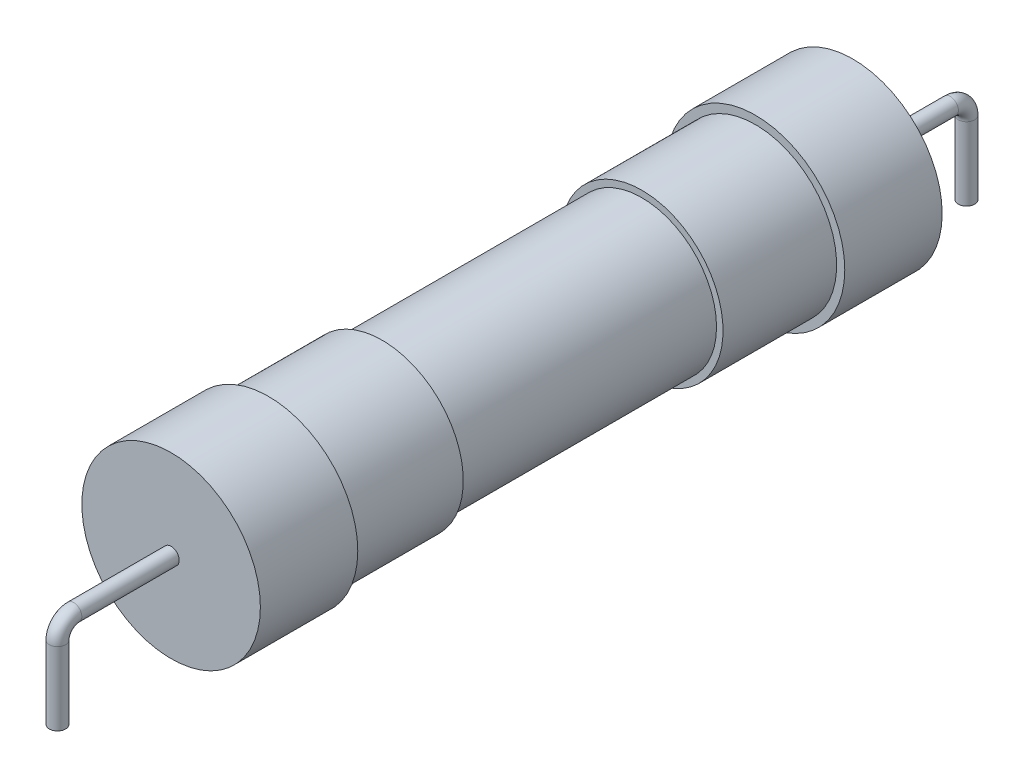
ISO-10303-21;
HEADER;
FILE_DESCRIPTION(('STEP AP214'),'2;1');
FILE_NAME('part.step','',(''),(''),'','','');
FILE_SCHEMA(('AUTOMOTIVE_DESIGN { 1 0 10303 214 1 1 1 1 }'));
ENDSEC;
DATA;
#1=APPLICATION_CONTEXT('core data for automotive mechanical design processes');
#2=APPLICATION_PROTOCOL_DEFINITION('international standard','automotive_design',2000,#1);
#3=PRODUCT_CONTEXT('',#1,'mechanical');
#4=PRODUCT('Part','Part','',(#3));
#5=PRODUCT_RELATED_PRODUCT_CATEGORY('part','',(#4));
#6=PRODUCT_DEFINITION_FORMATION('','',#4);
#7=PRODUCT_DEFINITION_CONTEXT('part definition',#1,'design');
#8=PRODUCT_DEFINITION('design','',#6,#7);
#9=PRODUCT_DEFINITION_SHAPE('','',#8);
#10=(LENGTH_UNIT() NAMED_UNIT(*) SI_UNIT(.MILLI.,.METRE.));
#11=(NAMED_UNIT(*) PLANE_ANGLE_UNIT() SI_UNIT($,.RADIAN.));
#12=(NAMED_UNIT(*) SI_UNIT($,.STERADIAN.) SOLID_ANGLE_UNIT());
#13=UNCERTAINTY_MEASURE_WITH_UNIT(LENGTH_MEASURE(1.E-05),#10,'distance_accuracy_value','');
#14=(GEOMETRIC_REPRESENTATION_CONTEXT(3) GLOBAL_UNCERTAINTY_ASSIGNED_CONTEXT((#13)) GLOBAL_UNIT_ASSIGNED_CONTEXT((#10,
#11,#12)) REPRESENTATION_CONTEXT('',''));
#15=CARTESIAN_POINT('',(0.,0.,0.));
#16=DIRECTION('',(0.,0.,1.));
#17=DIRECTION('',(1.,0.,0.));
#18=AXIS2_PLACEMENT_3D('',#15,#16,#17);
#19=CARTESIAN_POINT('',(0.,-2.75,14.));
#20=DIRECTION('',(0.,-1.,0.));
#21=DIRECTION('',(0.,0.,-1.));
#22=AXIS2_PLACEMENT_3D('',#19,#20,#21);
#23=PLANE('',#22);
#24=CARTESIAN_POINT('',(0.,-2.75,14.));
#25=DIRECTION('',(0.,-1.,0.));
#26=DIRECTION('',(0.,0.,-1.));
#27=AXIS2_PLACEMENT_3D('',#24,#25,#26);
#28=CIRCLE('',#27,0.25);
#29=CARTESIAN_POINT('',(0.,-2.75,13.75));
#30=VERTEX_POINT('',#29);
#31=EDGE_CURVE('E18',#30,#30,#28,.F.);
#32=ORIENTED_EDGE('',*,*,#31,.F.);
#33=EDGE_LOOP('',(#32));
#34=FACE_BOUND('',#33,.T.);
#35=ADVANCED_FACE('F15',(#34),#23,.T.);
#36=CARTESIAN_POINT('',(0.,-2.75,-14.));
#37=DIRECTION('',(0.,1.,0.));
#38=DIRECTION('',(0.,0.,1.));
#39=AXIS2_PLACEMENT_3D('',#36,#37,#38);
#40=PLANE('',#39);
#41=CARTESIAN_POINT('',(0.,-2.75,-14.));
#42=DIRECTION('',(0.,1.,0.));
#43=DIRECTION('',(0.,0.,1.));
#44=AXIS2_PLACEMENT_3D('',#41,#42,#43);
#45=CIRCLE('',#44,0.25);
#46=CARTESIAN_POINT('',(0.,-2.75,-13.75));
#47=VERTEX_POINT('',#46);
#48=EDGE_CURVE('E62',#47,#47,#45,.T.);
#49=ORIENTED_EDGE('',*,*,#48,.F.);
#50=EDGE_LOOP('',(#49));
#51=FACE_BOUND('',#50,.T.);
#52=ADVANCED_FACE('F75',(#51),#40,.F.);
#53=CARTESIAN_POINT('',(0.,-0.5,14.));
#54=DIRECTION('',(0.,-1.,0.));
#55=DIRECTION('',(0.,0.,-1.));
#56=AXIS2_PLACEMENT_3D('',#53,#54,#55);
#57=CYLINDRICAL_SURFACE('',#56,0.25);
#58=ORIENTED_EDGE('',*,*,#31,.T.);
#59=EDGE_LOOP('',(#58));
#60=FACE_BOUND('',#59,.T.);
#61=CARTESIAN_POINT('',(0.,-0.5,14.));
#62=DIRECTION('',(0.,-1.,0.));
#63=DIRECTION('',(0.,0.,1.));
#64=AXIS2_PLACEMENT_3D('',#61,#62,#63);
#65=CIRCLE('',#64,0.25);
#66=CARTESIAN_POINT('',(0.,-0.5,14.25));
#67=VERTEX_POINT('',#66);
#68=EDGE_CURVE('E30',#67,#67,#65,.F.);
#69=ORIENTED_EDGE('',*,*,#68,.F.);
#70=EDGE_LOOP('',(#69));
#71=FACE_BOUND('',#70,.T.);
#72=ADVANCED_FACE('F71',(#60,#71),#57,.T.);
#73=CARTESIAN_POINT('',(0.,-0.5,-14.));
#74=DIRECTION('',(0.,1.,0.));
#75=DIRECTION('',(0.,0.,1.));
#76=AXIS2_PLACEMENT_3D('',#73,#74,#75);
#77=CYLINDRICAL_SURFACE('',#76,0.25);
#78=ORIENTED_EDGE('',*,*,#48,.T.);
#79=EDGE_LOOP('',(#78));
#80=FACE_BOUND('',#79,.T.);
#81=CARTESIAN_POINT('',(0.,-0.5,-14.));
#82=DIRECTION('',(0.,-1.,0.));
#83=DIRECTION('',(0.,0.,-1.));
#84=AXIS2_PLACEMENT_3D('',#81,#82,#83);
#85=CIRCLE('',#84,0.25);
#86=CARTESIAN_POINT('',(0.,-0.5,-14.25));
#87=VERTEX_POINT('',#86);
#88=EDGE_CURVE('E67',#87,#87,#85,.F.);
#89=ORIENTED_EDGE('',*,*,#88,.F.);
#90=EDGE_LOOP('',(#89));
#91=FACE_BOUND('',#90,.T.);
#92=ADVANCED_FACE('F154',(#80,#91),#77,.T.);
#93=CARTESIAN_POINT('',(0.,-0.5,13.5));
#94=DIRECTION('',(1.,0.,0.));
#95=DIRECTION('',(0.,-1.,0.));
#96=AXIS2_PLACEMENT_3D('',#93,#94,#95);
#97=TOROIDAL_SURFACE('',#96,0.5,0.25);
#98=ORIENTED_EDGE('',*,*,#68,.T.);
#99=EDGE_LOOP('',(#98));
#100=FACE_BOUND('',#99,.T.);
#101=CARTESIAN_POINT('',(0.,0.,13.5));
#102=DIRECTION('',(0.,0.,1.));
#103=DIRECTION('',(1.,0.,0.));
#104=AXIS2_PLACEMENT_3D('',#101,#102,#103);
#105=CIRCLE('',#104,0.25);
#106=CARTESIAN_POINT('',(0.25,0.,13.5));
#107=VERTEX_POINT('',#106);
#108=EDGE_CURVE('E147',#107,#107,#105,.F.);
#109=ORIENTED_EDGE('',*,*,#108,.F.);
#110=EDGE_LOOP('',(#109));
#111=FACE_BOUND('',#110,.T.);
#112=ADVANCED_FACE('F140',(#100,#111),#97,.T.);
#113=CARTESIAN_POINT('',(0.,-0.5,-13.5));
#114=DIRECTION('',(-1.,0.,0.));
#115=DIRECTION('',(0.,-1.,0.));
#116=AXIS2_PLACEMENT_3D('',#113,#114,#115);
#117=TOROIDAL_SURFACE('',#116,0.5,0.25);
#118=ORIENTED_EDGE('',*,*,#88,.T.);
#119=EDGE_LOOP('',(#118));
#120=FACE_BOUND('',#119,.T.);
#121=CARTESIAN_POINT('',(0.,0.,-13.5));
#122=DIRECTION('',(0.,0.,1.));
#123=DIRECTION('',(1.,0.,0.));
#124=AXIS2_PLACEMENT_3D('',#121,#122,#123);
#125=CIRCLE('',#124,0.25);
#126=CARTESIAN_POINT('',(0.25,0.,-13.5));
#127=VERTEX_POINT('',#126);
#128=EDGE_CURVE('E61',#127,#127,#125,.T.);
#129=ORIENTED_EDGE('',*,*,#128,.F.);
#130=EDGE_LOOP('',(#129));
#131=FACE_BOUND('',#130,.T.);
#132=ADVANCED_FACE('F135',(#120,#131),#117,.T.);
#133=CARTESIAN_POINT('',(0.,0.,10.5));
#134=DIRECTION('',(0.,0.,1.));
#135=DIRECTION('',(1.,0.,0.));
#136=AXIS2_PLACEMENT_3D('',#133,#134,#135);
#137=CYLINDRICAL_SURFACE('',#136,0.25);
#138=ORIENTED_EDGE('',*,*,#108,.T.);
#139=EDGE_LOOP('',(#138));
#140=FACE_BOUND('',#139,.T.);
#141=CARTESIAN_POINT('',(0.,0.,10.5));
#142=DIRECTION('',(0.,0.,1.));
#143=DIRECTION('',(1.,0.,0.));
#144=AXIS2_PLACEMENT_3D('',#141,#142,#143);
#145=CIRCLE('',#144,0.25);
#146=CARTESIAN_POINT('',(0.25,0.,10.5));
#147=VERTEX_POINT('',#146);
#148=EDGE_CURVE('E59',#147,#147,#145,.F.);
#149=ORIENTED_EDGE('',*,*,#148,.F.);
#150=EDGE_LOOP('',(#149));
#151=FACE_BOUND('',#150,.T.);
#152=ADVANCED_FACE('F131',(#140,#151),#137,.T.);
#153=CARTESIAN_POINT('',(0.,0.,-10.5));
#154=DIRECTION('',(0.,0.,1.));
#155=DIRECTION('',(1.,0.,0.));
#156=AXIS2_PLACEMENT_3D('',#153,#154,#155);
#157=CYLINDRICAL_SURFACE('',#156,0.25);
#158=ORIENTED_EDGE('',*,*,#128,.T.);
#159=EDGE_LOOP('',(#158));
#160=FACE_BOUND('',#159,.T.);
#161=CARTESIAN_POINT('',(0.,0.,-10.5));
#162=DIRECTION('',(0.,0.,1.));
#163=DIRECTION('',(1.,0.,0.));
#164=AXIS2_PLACEMENT_3D('',#161,#162,#163);
#165=CIRCLE('',#164,0.25);
#166=CARTESIAN_POINT('',(0.25,0.,-10.5));
#167=VERTEX_POINT('',#166);
#168=EDGE_CURVE('E56',#167,#167,#165,.F.);
#169=ORIENTED_EDGE('',*,*,#168,.T.);
#170=EDGE_LOOP('',(#169));
#171=FACE_BOUND('',#170,.T.);
#172=ADVANCED_FACE('F127',(#160,#171),#157,.T.);
#173=CARTESIAN_POINT('',(0.,0.,10.5));
#174=DIRECTION('',(0.,0.,1.));
#175=DIRECTION('',(1.,0.,0.));
#176=AXIS2_PLACEMENT_3D('',#173,#174,#175);
#177=PLANE('',#176);
#178=ORIENTED_EDGE('',*,*,#148,.T.);
#179=EDGE_LOOP('',(#178));
#180=FACE_BOUND('',#179,.T.);
#181=CARTESIAN_POINT('',(0.,0.,10.5));
#182=DIRECTION('',(0.,0.,1.));
#183=DIRECTION('',(1.,0.,0.));
#184=AXIS2_PLACEMENT_3D('',#181,#182,#183);
#185=CIRCLE('',#184,2.75);
#186=CARTESIAN_POINT('',(2.75,0.,10.5));
#187=VERTEX_POINT('',#186);
#188=EDGE_CURVE('E53',#187,#187,#185,.F.);
#189=ORIENTED_EDGE('',*,*,#188,.F.);
#190=EDGE_LOOP('',(#189));
#191=FACE_BOUND('',#190,.T.);
#192=ADVANCED_FACE('F123',(#180,#191),#177,.T.);
#193=CARTESIAN_POINT('',(0.,0.,-10.5));
#194=DIRECTION('',(0.,0.,1.));
#195=DIRECTION('',(1.,0.,0.));
#196=AXIS2_PLACEMENT_3D('',#193,#194,#195);
#197=PLANE('',#196);
#198=ORIENTED_EDGE('',*,*,#168,.F.);
#199=EDGE_LOOP('',(#198));
#200=FACE_BOUND('',#199,.T.);
#201=CARTESIAN_POINT('',(0.,0.,-10.5));
#202=DIRECTION('',(0.,0.,1.));
#203=DIRECTION('',(1.,0.,0.));
#204=AXIS2_PLACEMENT_3D('',#201,#202,#203);
#205=CIRCLE('',#204,2.75);
#206=CARTESIAN_POINT('',(2.75,0.,-10.5));
#207=VERTEX_POINT('',#206);
#208=EDGE_CURVE('E50',#207,#207,#205,.T.);
#209=ORIENTED_EDGE('',*,*,#208,.F.);
#210=EDGE_LOOP('',(#209));
#211=FACE_BOUND('',#210,.T.);
#212=ADVANCED_FACE('F119',(#200,#211),#197,.F.);
#213=CARTESIAN_POINT('',(0.,0.,10.5));
#214=DIRECTION('',(0.,0.,1.));
#215=DIRECTION('',(1.,0.,0.));
#216=AXIS2_PLACEMENT_3D('',#213,#214,#215);
#217=CYLINDRICAL_SURFACE('',#216,2.75);
#218=CARTESIAN_POINT('',(0.,0.,7.5));
#219=DIRECTION('',(0.,0.,1.));
#220=DIRECTION('',(1.,0.,0.));
#221=AXIS2_PLACEMENT_3D('',#218,#219,#220);
#222=CIRCLE('',#221,2.75);
#223=CARTESIAN_POINT('',(2.75,0.,7.5));
#224=VERTEX_POINT('',#223);
#225=EDGE_CURVE('E47',#224,#224,#222,.T.);
#226=ORIENTED_EDGE('',*,*,#225,.T.);
#227=EDGE_LOOP('',(#226));
#228=FACE_BOUND('',#227,.T.);
#229=ORIENTED_EDGE('',*,*,#188,.T.);
#230=EDGE_LOOP('',(#229));
#231=FACE_BOUND('',#230,.T.);
#232=ADVANCED_FACE('F115',(#228,#231),#217,.T.);
#233=CARTESIAN_POINT('',(0.,0.,-10.5));
#234=DIRECTION('',(0.,0.,1.));
#235=DIRECTION('',(1.,0.,0.));
#236=AXIS2_PLACEMENT_3D('',#233,#234,#235);
#237=CYLINDRICAL_SURFACE('',#236,2.75);
#238=CARTESIAN_POINT('',(0.,0.,-7.5));
#239=DIRECTION('',(0.,0.,1.));
#240=DIRECTION('',(1.,0.,0.));
#241=AXIS2_PLACEMENT_3D('',#238,#239,#240);
#242=CIRCLE('',#241,2.75);
#243=CARTESIAN_POINT('',(2.75,0.,-7.5));
#244=VERTEX_POINT('',#243);
#245=EDGE_CURVE('E44',#244,#244,#242,.T.);
#246=ORIENTED_EDGE('',*,*,#245,.F.);
#247=EDGE_LOOP('',(#246));
#248=FACE_BOUND('',#247,.T.);
#249=ORIENTED_EDGE('',*,*,#208,.T.);
#250=EDGE_LOOP('',(#249));
#251=FACE_BOUND('',#250,.T.);
#252=ADVANCED_FACE('F111',(#248,#251),#237,.T.);
#253=CARTESIAN_POINT('',(0.,0.,7.5));
#254=DIRECTION('',(0.,0.,1.));
#255=DIRECTION('',(1.,0.,0.));
#256=AXIS2_PLACEMENT_3D('',#253,#254,#255);
#257=PLANE('',#256);
#258=CARTESIAN_POINT('',(0.,0.,7.5));
#259=DIRECTION('',(0.,0.,-1.));
#260=DIRECTION('',(-1.,0.,0.));
#261=AXIS2_PLACEMENT_3D('',#258,#259,#260);
#262=CIRCLE('',#261,2.5);
#263=CARTESIAN_POINT('',(-2.5,0.,7.5));
#264=VERTEX_POINT('',#263);
#265=EDGE_CURVE('E41',#264,#264,#262,.T.);
#266=ORIENTED_EDGE('',*,*,#265,.F.);
#267=EDGE_LOOP('',(#266));
#268=FACE_BOUND('',#267,.T.);
#269=ORIENTED_EDGE('',*,*,#225,.F.);
#270=EDGE_LOOP('',(#269));
#271=FACE_BOUND('',#270,.T.);
#272=ADVANCED_FACE('F107',(#268,#271),#257,.F.);
#273=CARTESIAN_POINT('',(0.,0.,-7.5));
#274=DIRECTION('',(0.,0.,1.));
#275=DIRECTION('',(1.,0.,0.));
#276=AXIS2_PLACEMENT_3D('',#273,#274,#275);
#277=PLANE('',#276);
#278=CARTESIAN_POINT('',(0.,0.,-7.5));
#279=DIRECTION('',(0.,0.,-1.));
#280=DIRECTION('',(-1.,0.,0.));
#281=AXIS2_PLACEMENT_3D('',#278,#279,#280);
#282=CIRCLE('',#281,2.5);
#283=CARTESIAN_POINT('',(-2.5,0.,-7.5));
#284=VERTEX_POINT('',#283);
#285=EDGE_CURVE('E38',#284,#284,#282,.F.);
#286=ORIENTED_EDGE('',*,*,#285,.F.);
#287=EDGE_LOOP('',(#286));
#288=FACE_BOUND('',#287,.T.);
#289=ORIENTED_EDGE('',*,*,#245,.T.);
#290=EDGE_LOOP('',(#289));
#291=FACE_BOUND('',#290,.T.);
#292=ADVANCED_FACE('F103',(#288,#291),#277,.T.);
#293=CARTESIAN_POINT('',(0.,0.,7.5));
#294=DIRECTION('',(0.,0.,-1.));
#295=DIRECTION('',(-1.,0.,0.));
#296=AXIS2_PLACEMENT_3D('',#293,#294,#295);
#297=CYLINDRICAL_SURFACE('',#296,2.5);
#298=CARTESIAN_POINT('',(0.,0.,4.));
#299=DIRECTION('',(0.,0.,-1.));
#300=DIRECTION('',(-1.,0.,0.));
#301=AXIS2_PLACEMENT_3D('',#298,#299,#300);
#302=CIRCLE('',#301,2.5);
#303=CARTESIAN_POINT('',(-2.5,0.,4.));
#304=VERTEX_POINT('',#303);
#305=EDGE_CURVE('E35',#304,#304,#302,.T.);
#306=ORIENTED_EDGE('',*,*,#305,.F.);
#307=EDGE_LOOP('',(#306));
#308=FACE_BOUND('',#307,.T.);
#309=ORIENTED_EDGE('',*,*,#265,.T.);
#310=EDGE_LOOP('',(#309));
#311=FACE_BOUND('',#310,.T.);
#312=ADVANCED_FACE('F99',(#308,#311),#297,.T.);
#313=CARTESIAN_POINT('',(0.,0.,-7.5));
#314=DIRECTION('',(0.,0.,-1.));
#315=DIRECTION('',(-1.,0.,0.));
#316=AXIS2_PLACEMENT_3D('',#313,#314,#315);
#317=CYLINDRICAL_SURFACE('',#316,2.5);
#318=CARTESIAN_POINT('',(0.,0.,-4.));
#319=DIRECTION('',(0.,0.,-1.));
#320=DIRECTION('',(-1.,0.,0.));
#321=AXIS2_PLACEMENT_3D('',#318,#319,#320);
#322=CIRCLE('',#321,2.5);
#323=CARTESIAN_POINT('',(-2.5,0.,-4.));
#324=VERTEX_POINT('',#323);
#325=EDGE_CURVE('E27',#324,#324,#322,.T.);
#326=ORIENTED_EDGE('',*,*,#325,.T.);
#327=EDGE_LOOP('',(#326));
#328=FACE_BOUND('',#327,.T.);
#329=ORIENTED_EDGE('',*,*,#285,.T.);
#330=EDGE_LOOP('',(#329));
#331=FACE_BOUND('',#330,.T.);
#332=ADVANCED_FACE('F95',(#328,#331),#317,.T.);
#333=CARTESIAN_POINT('',(0.,0.,4.));
#334=DIRECTION('',(0.,0.,-1.));
#335=DIRECTION('',(-1.,0.,0.));
#336=AXIS2_PLACEMENT_3D('',#333,#334,#335);
#337=PLANE('',#336);
#338=CARTESIAN_POINT('',(0.,0.,4.));
#339=DIRECTION('',(0.,0.,1.));
#340=DIRECTION('',(1.,0.,0.));
#341=AXIS2_PLACEMENT_3D('',#338,#339,#340);
#342=CIRCLE('',#341,2.3);
#343=CARTESIAN_POINT('',(2.3,0.,4.));
#344=VERTEX_POINT('',#343);
#345=EDGE_CURVE('E22',#344,#344,#342,.F.);
#346=ORIENTED_EDGE('',*,*,#345,.F.);
#347=EDGE_LOOP('',(#346));
#348=FACE_BOUND('',#347,.T.);
#349=ORIENTED_EDGE('',*,*,#305,.T.);
#350=EDGE_LOOP('',(#349));
#351=FACE_BOUND('',#350,.T.);
#352=ADVANCED_FACE('F89',(#348,#351),#337,.T.);
#353=CARTESIAN_POINT('',(0.,0.,-4.));
#354=DIRECTION('',(0.,0.,-1.));
#355=DIRECTION('',(-1.,0.,0.));
#356=AXIS2_PLACEMENT_3D('',#353,#354,#355);
#357=PLANE('',#356);
#358=CARTESIAN_POINT('',(0.,0.,-4.));
#359=DIRECTION('',(0.,0.,1.));
#360=DIRECTION('',(1.,0.,0.));
#361=AXIS2_PLACEMENT_3D('',#358,#359,#360);
#362=CIRCLE('',#361,2.3);
#363=CARTESIAN_POINT('',(2.3,0.,-4.));
#364=VERTEX_POINT('',#363);
#365=EDGE_CURVE('E10',#364,#364,#362,.T.);
#366=ORIENTED_EDGE('',*,*,#365,.F.);
#367=EDGE_LOOP('',(#366));
#368=FACE_BOUND('',#367,.T.);
#369=ORIENTED_EDGE('',*,*,#325,.F.);
#370=EDGE_LOOP('',(#369));
#371=FACE_BOUND('',#370,.T.);
#372=ADVANCED_FACE('F83',(#368,#371),#357,.F.);
#373=CARTESIAN_POINT('',(0.,0.,-10.5));
#374=DIRECTION('',(0.,0.,1.));
#375=DIRECTION('',(1.,0.,0.));
#376=AXIS2_PLACEMENT_3D('',#373,#374,#375);
#377=CYLINDRICAL_SURFACE('',#376,2.3);
#378=ORIENTED_EDGE('',*,*,#345,.T.);
#379=EDGE_LOOP('',(#378));
#380=FACE_BOUND('',#379,.T.);
#381=ORIENTED_EDGE('',*,*,#365,.T.);
#382=EDGE_LOOP('',(#381));
#383=FACE_BOUND('',#382,.T.);
#384=ADVANCED_FACE('F81',(#380,#383),#377,.T.);
#385=CLOSED_SHELL('',(#35,#52,#72,#92,#112,#132,#152,#172,#192,#212,#232,#252,#272,#292,#312,
#332,#352,#372,#384));
#386=MANIFOLD_SOLID_BREP('B1',#385);
#387=ADVANCED_BREP_SHAPE_REPRESENTATION('',(#18,#386),#14);
#388=SHAPE_DEFINITION_REPRESENTATION(#9,#387);
ENDSEC;
END-ISO-10303-21;
